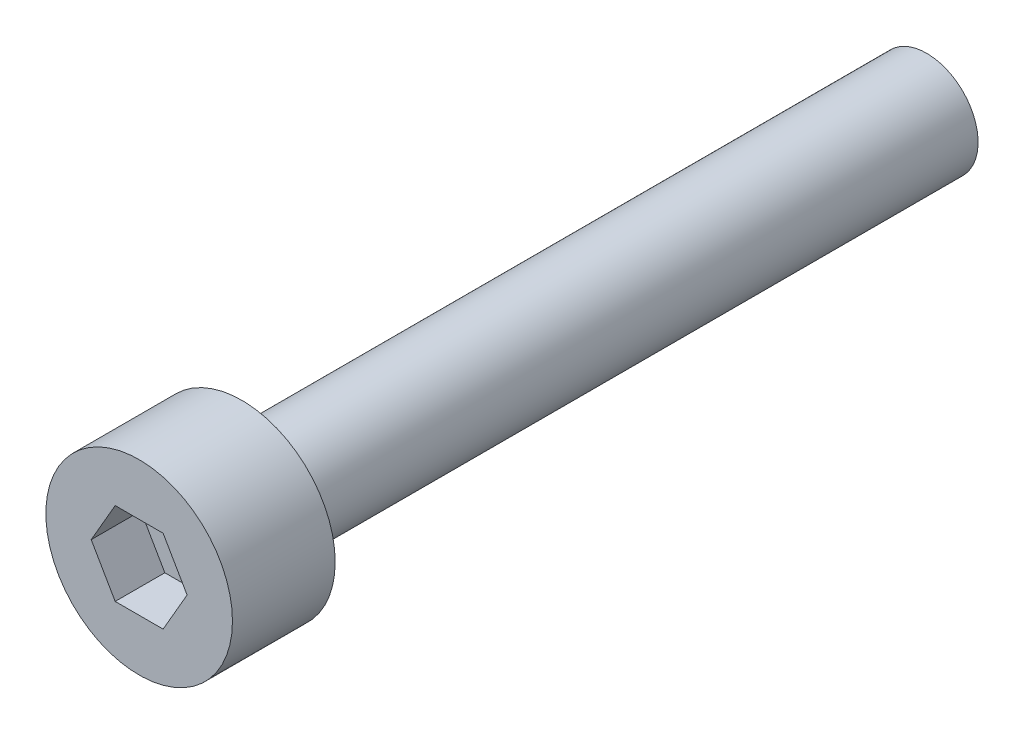
ISO-10303-21;
HEADER;
FILE_DESCRIPTION(('STEP AP214'),'2;1');
FILE_NAME('part.step','',(''),(''),'','','');
FILE_SCHEMA(('AUTOMOTIVE_DESIGN { 1 0 10303 214 1 1 1 1 }'));
ENDSEC;
DATA;
#1=APPLICATION_CONTEXT('core data for automotive mechanical design processes');
#2=APPLICATION_PROTOCOL_DEFINITION('international standard','automotive_design',2000,#1);
#3=PRODUCT_CONTEXT('',#1,'mechanical');
#4=PRODUCT('Part','Part','',(#3));
#5=PRODUCT_RELATED_PRODUCT_CATEGORY('part','',(#4));
#6=PRODUCT_DEFINITION_FORMATION('','',#4);
#7=PRODUCT_DEFINITION_CONTEXT('part definition',#1,'design');
#8=PRODUCT_DEFINITION('design','',#6,#7);
#9=PRODUCT_DEFINITION_SHAPE('','',#8);
#10=(LENGTH_UNIT() NAMED_UNIT(*) SI_UNIT(.MILLI.,.METRE.));
#11=(NAMED_UNIT(*) PLANE_ANGLE_UNIT() SI_UNIT($,.RADIAN.));
#12=(NAMED_UNIT(*) SI_UNIT($,.STERADIAN.) SOLID_ANGLE_UNIT());
#13=UNCERTAINTY_MEASURE_WITH_UNIT(LENGTH_MEASURE(1.E-05),#10,'distance_accuracy_value','');
#14=(GEOMETRIC_REPRESENTATION_CONTEXT(3) GLOBAL_UNCERTAINTY_ASSIGNED_CONTEXT((#13)) GLOBAL_UNIT_ASSIGNED_CONTEXT((#10,
#11,#12)) REPRESENTATION_CONTEXT('',''));
#15=CARTESIAN_POINT('',(0.,0.,0.));
#16=DIRECTION('',(0.,0.,1.));
#17=DIRECTION('',(1.,0.,0.));
#18=AXIS2_PLACEMENT_3D('',#15,#16,#17);
#19=CARTESIAN_POINT('',(2.725,0.,-3.));
#20=DIRECTION('',(0.,0.,-1.));
#21=DIRECTION('',(-1.,0.,0.));
#22=AXIS2_PLACEMENT_3D('',#19,#20,#21);
#23=PLANE('',#22);
#24=CARTESIAN_POINT('',(0.,0.,-3.));
#25=DIRECTION('',(0.,0.,1.));
#26=DIRECTION('',(1.,0.,0.));
#27=AXIS2_PLACEMENT_3D('',#24,#25,#26);
#28=CIRCLE('',#27,2.725);
#29=CARTESIAN_POINT('',(2.725,0.,-3.));
#30=VERTEX_POINT('',#29);
#31=EDGE_CURVE('E11',#30,#30,#28,.T.);
#32=ORIENTED_EDGE('',*,*,#31,.F.);
#33=EDGE_LOOP('',(#32));
#34=FACE_BOUND('',#33,.T.);
#35=CARTESIAN_POINT('',(0.,0.,-3.));
#36=DIRECTION('',(0.,0.,-1.));
#37=DIRECTION('',(-1.,0.,0.));
#38=AXIS2_PLACEMENT_3D('',#35,#36,#37);
#39=CIRCLE('',#38,1.5);
#40=CARTESIAN_POINT('',(-1.5,0.,-3.));
#41=VERTEX_POINT('',#40);
#42=EDGE_CURVE('E142',#41,#41,#39,.T.);
#43=ORIENTED_EDGE('',*,*,#42,.F.);
#44=EDGE_LOOP('',(#43));
#45=FACE_BOUND('',#44,.T.);
#46=ADVANCED_FACE('F32',(#34,#45),#23,.T.);
#47=CARTESIAN_POINT('',(0.,0.,-3.));
#48=DIRECTION('',(0.,0.,1.));
#49=DIRECTION('',(1.,0.,0.));
#50=AXIS2_PLACEMENT_3D('',#47,#48,#49);
#51=CYLINDRICAL_SURFACE('',#50,2.725);
#52=ORIENTED_EDGE('',*,*,#31,.T.);
#53=EDGE_LOOP('',(#52));
#54=FACE_BOUND('',#53,.T.);
#55=CARTESIAN_POINT('',(0.,0.,0.));
#56=DIRECTION('',(0.,0.,1.));
#57=DIRECTION('',(1.,0.,0.));
#58=AXIS2_PLACEMENT_3D('',#55,#56,#57);
#59=CIRCLE('',#58,2.725);
#60=CARTESIAN_POINT('',(2.725,0.,0.));
#61=VERTEX_POINT('',#60);
#62=EDGE_CURVE('E40',#61,#61,#59,.T.);
#63=ORIENTED_EDGE('',*,*,#62,.F.);
#64=EDGE_LOOP('',(#63));
#65=FACE_BOUND('',#64,.T.);
#66=ADVANCED_FACE('F34',(#54,#65),#51,.T.);
#67=CARTESIAN_POINT('',(0.,0.,0.));
#68=DIRECTION('',(0.,0.,1.));
#69=DIRECTION('',(1.,0.,0.));
#70=AXIS2_PLACEMENT_3D('',#67,#68,#69);
#71=PLANE('',#70);
#72=DIRECTION('',(-0.499999999999999,-0.86602540378444,0.));
#73=VECTOR('',#72,1.);
#74=CARTESIAN_POINT('',(-0.7,1.21243556529821,0.));
#75=LINE('',#74,#73);
#76=CARTESIAN_POINT('',(-0.7,1.21243556529821,0.));
#77=VERTEX_POINT('',#76);
#78=CARTESIAN_POINT('',(-1.4,0.,0.));
#79=VERTEX_POINT('',#78);
#80=EDGE_CURVE('E47',#77,#79,#75,.T.);
#81=ORIENTED_EDGE('',*,*,#80,.F.);
#82=DIRECTION('',(-1.,0.,0.));
#83=VECTOR('',#82,1.);
#84=CARTESIAN_POINT('',(0.700000000000003,1.21243556529822,0.));
#85=LINE('',#84,#83);
#86=CARTESIAN_POINT('',(0.700000000000003,1.21243556529822,0.));
#87=VERTEX_POINT('',#86);
#88=EDGE_CURVE('E130',#87,#77,#85,.T.);
#89=ORIENTED_EDGE('',*,*,#88,.F.);
#90=DIRECTION('',(-0.500000000000001,0.866025403784438,0.));
#91=VECTOR('',#90,1.);
#92=CARTESIAN_POINT('',(1.4,0.,0.));
#93=LINE('',#92,#91);
#94=CARTESIAN_POINT('',(1.4,0.,0.));
#95=VERTEX_POINT('',#94);
#96=EDGE_CURVE('E128',#95,#87,#93,.T.);
#97=ORIENTED_EDGE('',*,*,#96,.F.);
#98=DIRECTION('',(0.499999999999999,0.866025403784439,0.));
#99=VECTOR('',#98,1.);
#100=CARTESIAN_POINT('',(0.700000000000005,-1.21243556529821,0.));
#101=LINE('',#100,#99);
#102=CARTESIAN_POINT('',(0.700000000000005,-1.21243556529821,0.));
#103=VERTEX_POINT('',#102);
#104=EDGE_CURVE('E95',#103,#95,#101,.T.);
#105=ORIENTED_EDGE('',*,*,#104,.F.);
#106=DIRECTION('',(1.,0.,0.));
#107=VECTOR('',#106,1.);
#108=CARTESIAN_POINT('',(-0.699999999999997,-1.21243556529822,0.));
#109=LINE('',#108,#107);
#110=CARTESIAN_POINT('',(-0.699999999999997,-1.21243556529822,0.));
#111=VERTEX_POINT('',#110);
#112=EDGE_CURVE('E124',#111,#103,#109,.T.);
#113=ORIENTED_EDGE('',*,*,#112,.F.);
#114=DIRECTION('',(0.5,-0.866025403784438,0.));
#115=VECTOR('',#114,1.);
#116=CARTESIAN_POINT('',(-1.4,0.,0.));
#117=LINE('',#116,#115);
#118=EDGE_CURVE('E121',#79,#111,#117,.T.);
#119=ORIENTED_EDGE('',*,*,#118,.F.);
#120=EDGE_LOOP('',(#81,#89,#97,#105,#113,#119));
#121=FACE_BOUND('',#120,.T.);
#122=ORIENTED_EDGE('',*,*,#62,.T.);
#123=EDGE_LOOP('',(#122));
#124=FACE_BOUND('',#123,.T.);
#125=ADVANCED_FACE('F147',(#121,#124),#71,.T.);
#126=CARTESIAN_POINT('',(0.,0.,-6.));
#127=DIRECTION('',(0.,0.,1.));
#128=DIRECTION('',(1.,0.,0.));
#129=AXIS2_PLACEMENT_3D('',#126,#127,#128);
#130=CYLINDRICAL_SURFACE('',#129,1.5);
#131=ORIENTED_EDGE('',*,*,#42,.T.);
#132=EDGE_LOOP('',(#131));
#133=FACE_BOUND('',#132,.T.);
#134=CARTESIAN_POINT('',(0.,0.,-23.));
#135=DIRECTION('',(0.,0.,-1.));
#136=DIRECTION('',(-1.,0.,0.));
#137=AXIS2_PLACEMENT_3D('',#134,#135,#136);
#138=CIRCLE('',#137,1.5);
#139=CARTESIAN_POINT('',(-1.5,0.,-23.));
#140=VERTEX_POINT('',#139);
#141=EDGE_CURVE('E134',#140,#140,#138,.T.);
#142=ORIENTED_EDGE('',*,*,#141,.F.);
#143=EDGE_LOOP('',(#142));
#144=FACE_BOUND('',#143,.T.);
#145=ADVANCED_FACE('F155',(#133,#144),#130,.T.);
#146=CARTESIAN_POINT('',(0.,0.,-23.));
#147=DIRECTION('',(0.,0.,-1.));
#148=DIRECTION('',(-1.,0.,0.));
#149=AXIS2_PLACEMENT_3D('',#146,#147,#148);
#150=PLANE('',#149);
#151=ORIENTED_EDGE('',*,*,#141,.T.);
#152=EDGE_LOOP('',(#151));
#153=FACE_BOUND('',#152,.T.);
#154=ADVANCED_FACE('F165',(#153),#150,.T.);
#155=CARTESIAN_POINT('',(-0.7,1.21243556529821,-1.45));
#156=DIRECTION('',(-0.866025403784439,0.499999999999999,0.));
#157=DIRECTION('',(-0.499999999999999,-0.866025403784439,0.));
#158=AXIS2_PLACEMENT_3D('',#155,#156,#157);
#159=PLANE('',#158);
#160=ORIENTED_EDGE('',*,*,#80,.T.);
#161=DIRECTION('',(0.,0.,1.));
#162=VECTOR('',#161,1.);
#163=CARTESIAN_POINT('',(-1.4,0.,-1.45));
#164=LINE('',#163,#162);
#165=CARTESIAN_POINT('',(-1.4,0.,-1.45));
#166=VERTEX_POINT('',#165);
#167=EDGE_CURVE('E77',#166,#79,#164,.T.);
#168=ORIENTED_EDGE('',*,*,#167,.F.);
#169=DIRECTION('',(-0.499999999999999,-0.86602540378444,0.));
#170=VECTOR('',#169,1.);
#171=CARTESIAN_POINT('',(-0.7,1.21243556529821,-1.45));
#172=LINE('',#171,#170);
#173=CARTESIAN_POINT('',(-0.7,1.21243556529821,-1.45));
#174=VERTEX_POINT('',#173);
#175=EDGE_CURVE('E132',#174,#166,#172,.T.);
#176=ORIENTED_EDGE('',*,*,#175,.F.);
#177=DIRECTION('',(0.,0.,1.));
#178=VECTOR('',#177,1.);
#179=CARTESIAN_POINT('',(-0.7,1.21243556529821,-1.45));
#180=LINE('',#179,#178);
#181=EDGE_CURVE('E55',#174,#77,#180,.T.);
#182=ORIENTED_EDGE('',*,*,#181,.T.);
#183=EDGE_LOOP('',(#160,#168,#176,#182));
#184=FACE_BOUND('',#183,.T.);
#185=ADVANCED_FACE('F170',(#184),#159,.F.);
#186=CARTESIAN_POINT('',(0.700000000000003,1.21243556529822,-1.45));
#187=DIRECTION('',(0.,1.,0.));
#188=DIRECTION('',(-1.,0.,0.));
#189=AXIS2_PLACEMENT_3D('',#186,#187,#188);
#190=PLANE('',#189);
#191=ORIENTED_EDGE('',*,*,#88,.T.);
#192=ORIENTED_EDGE('',*,*,#181,.F.);
#193=DIRECTION('',(-1.,0.,0.));
#194=VECTOR('',#193,1.);
#195=CARTESIAN_POINT('',(0.700000000000003,1.21243556529822,-1.45));
#196=LINE('',#195,#194);
#197=CARTESIAN_POINT('',(0.700000000000003,1.21243556529822,-1.45));
#198=VERTEX_POINT('',#197);
#199=EDGE_CURVE('E107',#198,#174,#196,.T.);
#200=ORIENTED_EDGE('',*,*,#199,.F.);
#201=DIRECTION('',(0.,0.,1.));
#202=VECTOR('',#201,1.);
#203=CARTESIAN_POINT('',(0.700000000000003,1.21243556529822,-1.45));
#204=LINE('',#203,#202);
#205=EDGE_CURVE('E99',#198,#87,#204,.T.);
#206=ORIENTED_EDGE('',*,*,#205,.T.);
#207=EDGE_LOOP('',(#191,#192,#200,#206));
#208=FACE_BOUND('',#207,.T.);
#209=ADVANCED_FACE('F175',(#208),#190,.F.);
#210=CARTESIAN_POINT('',(1.4,0.,-1.45));
#211=DIRECTION('',(0.866025403784438,0.500000000000001,0.));
#212=DIRECTION('',(-0.500000000000001,0.866025403784438,0.));
#213=AXIS2_PLACEMENT_3D('',#210,#211,#212);
#214=PLANE('',#213);
#215=ORIENTED_EDGE('',*,*,#96,.T.);
#216=ORIENTED_EDGE('',*,*,#205,.F.);
#217=DIRECTION('',(-0.500000000000001,0.866025403784438,0.));
#218=VECTOR('',#217,1.);
#219=CARTESIAN_POINT('',(1.4,0.,-1.45));
#220=LINE('',#219,#218);
#221=CARTESIAN_POINT('',(1.4,0.,-1.45));
#222=VERTEX_POINT('',#221);
#223=EDGE_CURVE('E103',#222,#198,#220,.T.);
#224=ORIENTED_EDGE('',*,*,#223,.F.);
#225=DIRECTION('',(0.,0.,1.));
#226=VECTOR('',#225,1.);
#227=CARTESIAN_POINT('',(1.4,0.,-1.45));
#228=LINE('',#227,#226);
#229=EDGE_CURVE('E88',#222,#95,#228,.T.);
#230=ORIENTED_EDGE('',*,*,#229,.T.);
#231=EDGE_LOOP('',(#215,#216,#224,#230));
#232=FACE_BOUND('',#231,.T.);
#233=ADVANCED_FACE('F104',(#232),#214,.F.);
#234=CARTESIAN_POINT('',(0.700000000000005,-1.21243556529821,-1.45));
#235=DIRECTION('',(0.866025403784439,-0.499999999999999,0.));
#236=DIRECTION('',(0.499999999999999,0.866025403784439,0.));
#237=AXIS2_PLACEMENT_3D('',#234,#235,#236);
#238=PLANE('',#237);
#239=ORIENTED_EDGE('',*,*,#104,.T.);
#240=ORIENTED_EDGE('',*,*,#229,.F.);
#241=DIRECTION('',(0.499999999999999,0.866025403784439,0.));
#242=VECTOR('',#241,1.);
#243=CARTESIAN_POINT('',(0.700000000000005,-1.21243556529821,-1.45));
#244=LINE('',#243,#242);
#245=CARTESIAN_POINT('',(0.700000000000005,-1.21243556529821,-1.45));
#246=VERTEX_POINT('',#245);
#247=EDGE_CURVE('E92',#246,#222,#244,.T.);
#248=ORIENTED_EDGE('',*,*,#247,.F.);
#249=DIRECTION('',(0.,0.,1.));
#250=VECTOR('',#249,1.);
#251=CARTESIAN_POINT('',(0.700000000000005,-1.21243556529821,-1.45));
#252=LINE('',#251,#250);
#253=EDGE_CURVE('E100',#246,#103,#252,.T.);
#254=ORIENTED_EDGE('',*,*,#253,.T.);
#255=EDGE_LOOP('',(#239,#240,#248,#254));
#256=FACE_BOUND('',#255,.T.);
#257=ADVANCED_FACE('F90',(#256),#238,.F.);
#258=CARTESIAN_POINT('',(-0.699999999999997,-1.21243556529822,-1.45));
#259=DIRECTION('',(0.,-1.,0.));
#260=DIRECTION('',(1.,0.,0.));
#261=AXIS2_PLACEMENT_3D('',#258,#259,#260);
#262=PLANE('',#261);
#263=ORIENTED_EDGE('',*,*,#112,.T.);
#264=ORIENTED_EDGE('',*,*,#253,.F.);
#265=DIRECTION('',(1.,0.,0.));
#266=VECTOR('',#265,1.);
#267=CARTESIAN_POINT('',(-0.699999999999997,-1.21243556529822,-1.45));
#268=LINE('',#267,#266);
#269=CARTESIAN_POINT('',(-0.699999999999997,-1.21243556529822,-1.45));
#270=VERTEX_POINT('',#269);
#271=EDGE_CURVE('E113',#270,#246,#268,.T.);
#272=ORIENTED_EDGE('',*,*,#271,.F.);
#273=DIRECTION('',(0.,0.,1.));
#274=VECTOR('',#273,1.);
#275=CARTESIAN_POINT('',(-0.699999999999997,-1.21243556529822,-1.45));
#276=LINE('',#275,#274);
#277=EDGE_CURVE('E137',#270,#111,#276,.T.);
#278=ORIENTED_EDGE('',*,*,#277,.T.);
#279=EDGE_LOOP('',(#263,#264,#272,#278));
#280=FACE_BOUND('',#279,.T.);
#281=ADVANCED_FACE('F181',(#280),#262,.F.);
#282=CARTESIAN_POINT('',(-1.4,0.,-1.45));
#283=DIRECTION('',(-0.866025403784438,-0.5,0.));
#284=DIRECTION('',(0.5,-0.866025403784438,0.));
#285=AXIS2_PLACEMENT_3D('',#282,#283,#284);
#286=PLANE('',#285);
#287=ORIENTED_EDGE('',*,*,#118,.T.);
#288=ORIENTED_EDGE('',*,*,#277,.F.);
#289=DIRECTION('',(0.5,-0.866025403784438,0.));
#290=VECTOR('',#289,1.);
#291=CARTESIAN_POINT('',(-1.4,0.,-1.45));
#292=LINE('',#291,#290);
#293=EDGE_CURVE('E115',#166,#270,#292,.T.);
#294=ORIENTED_EDGE('',*,*,#293,.F.);
#295=ORIENTED_EDGE('',*,*,#167,.T.);
#296=EDGE_LOOP('',(#287,#288,#294,#295));
#297=FACE_BOUND('',#296,.T.);
#298=ADVANCED_FACE('F178',(#297),#286,.F.);
#299=CARTESIAN_POINT('',(-1.4,0.,-1.45));
#300=DIRECTION('',(0.,0.,1.));
#301=DIRECTION('',(1.,0.,0.));
#302=AXIS2_PLACEMENT_3D('',#299,#300,#301);
#303=PLANE('',#302);
#304=ORIENTED_EDGE('',*,*,#175,.T.);
#305=ORIENTED_EDGE('',*,*,#293,.T.);
#306=ORIENTED_EDGE('',*,*,#271,.T.);
#307=ORIENTED_EDGE('',*,*,#247,.T.);
#308=ORIENTED_EDGE('',*,*,#223,.T.);
#309=ORIENTED_EDGE('',*,*,#199,.T.);
#310=EDGE_LOOP('',(#304,#305,#306,#307,#308,#309));
#311=FACE_BOUND('',#310,.T.);
#312=ADVANCED_FACE('F110',(#311),#303,.T.);
#313=CLOSED_SHELL('',(#46,#66,#125,#145,#154,#185,#209,#233,#257,#281,#298,#312));
#314=MANIFOLD_SOLID_BREP('B2',#313);
#315=ADVANCED_BREP_SHAPE_REPRESENTATION('',(#18,#314),#14);
#316=SHAPE_DEFINITION_REPRESENTATION(#9,#315);
ENDSEC;
END-ISO-10303-21;
